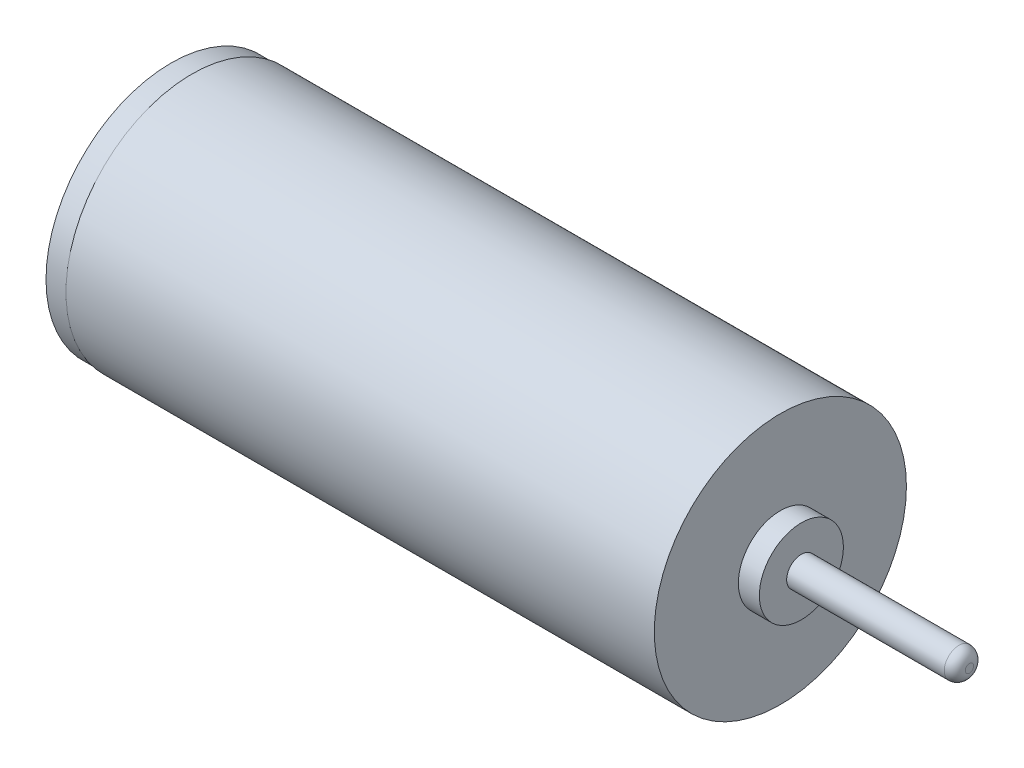
ISO-10303-21;
HEADER;
FILE_DESCRIPTION(('STEP AP214'),'2;1');
FILE_NAME('part.step','',(''),(''),'','','');
FILE_SCHEMA(('AUTOMOTIVE_DESIGN { 1 0 10303 214 1 1 1 1 }'));
ENDSEC;
DATA;
#1=APPLICATION_CONTEXT('core data for automotive mechanical design processes');
#2=APPLICATION_PROTOCOL_DEFINITION('international standard','automotive_design',2000,#1);
#3=PRODUCT_CONTEXT('',#1,'mechanical');
#4=PRODUCT('Part','Part','',(#3));
#5=PRODUCT_RELATED_PRODUCT_CATEGORY('part','',(#4));
#6=PRODUCT_DEFINITION_FORMATION('','',#4);
#7=PRODUCT_DEFINITION_CONTEXT('part definition',#1,'design');
#8=PRODUCT_DEFINITION('design','',#6,#7);
#9=PRODUCT_DEFINITION_SHAPE('','',#8);
#10=(LENGTH_UNIT() NAMED_UNIT(*) SI_UNIT(.MILLI.,.METRE.));
#11=(NAMED_UNIT(*) PLANE_ANGLE_UNIT() SI_UNIT($,.RADIAN.));
#12=(NAMED_UNIT(*) SI_UNIT($,.STERADIAN.) SOLID_ANGLE_UNIT());
#13=UNCERTAINTY_MEASURE_WITH_UNIT(LENGTH_MEASURE(1.E-05),#10,'distance_accuracy_value','');
#14=(GEOMETRIC_REPRESENTATION_CONTEXT(3) GLOBAL_UNCERTAINTY_ASSIGNED_CONTEXT((#13)) GLOBAL_UNIT_ASSIGNED_CONTEXT((#10,
#11,#12)) REPRESENTATION_CONTEXT('',''));
#15=CARTESIAN_POINT('',(0.,0.,0.));
#16=DIRECTION('',(0.,0.,1.));
#17=DIRECTION('',(1.,0.,0.));
#18=AXIS2_PLACEMENT_3D('',#15,#16,#17);
#19=CARTESIAN_POINT('',(-14.5,0.,0.));
#20=DIRECTION('',(-1.,0.,0.));
#21=DIRECTION('',(0.,0.,1.));
#22=AXIS2_PLACEMENT_3D('',#19,#20,#21);
#23=PLANE('',#22);
#24=CARTESIAN_POINT('',(-14.5,0.,0.));
#25=DIRECTION('',(-1.,0.,0.));
#26=DIRECTION('',(0.,0.,1.));
#27=AXIS2_PLACEMENT_3D('',#24,#25,#26);
#28=CIRCLE('',#27,2.975);
#29=CARTESIAN_POINT('',(-14.5,0.,2.975));
#30=VERTEX_POINT('',#29);
#31=EDGE_CURVE('E63',#30,#30,#28,.T.);
#32=ORIENTED_EDGE('',*,*,#31,.T.);
#33=EDGE_LOOP('',(#32));
#34=FACE_BOUND('',#33,.T.);
#35=CARTESIAN_POINT('',(-14.5,0.,0.));
#36=DIRECTION('',(-1.,0.,0.));
#37=DIRECTION('',(0.,0.,1.));
#38=AXIS2_PLACEMENT_3D('',#35,#36,#37);
#39=CIRCLE('',#38,1.);
#40=CARTESIAN_POINT('',(-14.5,0.,1.));
#41=VERTEX_POINT('',#40);
#42=EDGE_CURVE('E67',#41,#41,#39,.T.);
#43=ORIENTED_EDGE('',*,*,#42,.F.);
#44=EDGE_LOOP('',(#43));
#45=FACE_BOUND('',#44,.T.);
#46=ADVANCED_FACE('F31',(#34,#45),#23,.T.);
#47=CARTESIAN_POINT('',(-14.,0.,0.));
#48=DIRECTION('',(1.,0.,0.));
#49=DIRECTION('',(0.,0.,-1.));
#50=AXIS2_PLACEMENT_3D('',#47,#48,#49);
#51=PLANE('',#50);
#52=CARTESIAN_POINT('',(-14.,0.,0.));
#53=DIRECTION('',(1.,0.,0.));
#54=DIRECTION('',(0.,0.,-1.));
#55=AXIS2_PLACEMENT_3D('',#52,#53,#54);
#56=CIRCLE('',#55,3.);
#57=CARTESIAN_POINT('',(-14.,0.,-3.));
#58=VERTEX_POINT('',#57);
#59=EDGE_CURVE('E46',#58,#58,#56,.T.);
#60=ORIENTED_EDGE('',*,*,#59,.F.);
#61=EDGE_LOOP('',(#60));
#62=FACE_BOUND('',#61,.T.);
#63=CARTESIAN_POINT('',(-14.,0.,0.));
#64=DIRECTION('',(1.,0.,0.));
#65=DIRECTION('',(0.,0.,-1.));
#66=AXIS2_PLACEMENT_3D('',#63,#64,#65);
#67=CIRCLE('',#66,2.975);
#68=CARTESIAN_POINT('',(-14.,0.,-2.975));
#69=VERTEX_POINT('',#68);
#70=EDGE_CURVE('E10',#69,#69,#67,.F.);
#71=ORIENTED_EDGE('',*,*,#70,.F.);
#72=EDGE_LOOP('',(#71));
#73=FACE_BOUND('',#72,.T.);
#74=ADVANCED_FACE('F83',(#62,#73),#51,.F.);
#75=CARTESIAN_POINT('',(0.5,0.,0.));
#76=DIRECTION('',(1.,0.,0.));
#77=DIRECTION('',(0.,0.,-1.));
#78=AXIS2_PLACEMENT_3D('',#75,#76,#77);
#79=PLANE('',#78);
#80=CARTESIAN_POINT('',(0.5,0.,0.));
#81=DIRECTION('',(1.,0.,0.));
#82=DIRECTION('',(0.,0.,-1.));
#83=AXIS2_PLACEMENT_3D('',#80,#81,#82);
#84=CIRCLE('',#83,1.);
#85=CARTESIAN_POINT('',(0.5,0.,-1.));
#86=VERTEX_POINT('',#85);
#87=EDGE_CURVE('E52',#86,#86,#84,.T.);
#88=ORIENTED_EDGE('',*,*,#87,.T.);
#89=EDGE_LOOP('',(#88));
#90=FACE_BOUND('',#89,.T.);
#91=CARTESIAN_POINT('',(0.5,0.,0.));
#92=DIRECTION('',(1.,0.,0.));
#93=DIRECTION('',(0.,0.,-1.));
#94=AXIS2_PLACEMENT_3D('',#91,#92,#93);
#95=CIRCLE('',#94,0.35);
#96=CARTESIAN_POINT('',(0.5,0.,-0.35));
#97=VERTEX_POINT('',#96);
#98=EDGE_CURVE('E58',#97,#97,#95,.T.);
#99=ORIENTED_EDGE('',*,*,#98,.F.);
#100=EDGE_LOOP('',(#99));
#101=FACE_BOUND('',#100,.T.);
#102=ADVANCED_FACE('F89',(#90,#101),#79,.T.);
#103=CARTESIAN_POINT('',(0.,0.,0.));
#104=DIRECTION('',(1.,0.,0.));
#105=DIRECTION('',(0.,0.,-1.));
#106=AXIS2_PLACEMENT_3D('',#103,#104,#105);
#107=PLANE('',#106);
#108=CARTESIAN_POINT('',(0.,0.,0.));
#109=DIRECTION('',(1.,0.,0.));
#110=DIRECTION('',(0.,0.,-1.));
#111=AXIS2_PLACEMENT_3D('',#108,#109,#110);
#112=CIRCLE('',#111,3.);
#113=CARTESIAN_POINT('',(0.,0.,-3.));
#114=VERTEX_POINT('',#113);
#115=EDGE_CURVE('E49',#114,#114,#112,.T.);
#116=ORIENTED_EDGE('',*,*,#115,.T.);
#117=EDGE_LOOP('',(#116));
#118=FACE_BOUND('',#117,.T.);
#119=CARTESIAN_POINT('',(0.,0.,0.));
#120=DIRECTION('',(1.,0.,0.));
#121=DIRECTION('',(0.,0.,-1.));
#122=AXIS2_PLACEMENT_3D('',#119,#120,#121);
#123=CIRCLE('',#122,1.);
#124=CARTESIAN_POINT('',(0.,0.,-1.));
#125=VERTEX_POINT('',#124);
#126=EDGE_CURVE('E55',#125,#125,#123,.T.);
#127=ORIENTED_EDGE('',*,*,#126,.F.);
#128=EDGE_LOOP('',(#127));
#129=FACE_BOUND('',#128,.T.);
#130=ADVANCED_FACE('F107',(#118,#129),#107,.T.);
#131=CARTESIAN_POINT('',(-14.,0.,0.));
#132=DIRECTION('',(1.,0.,0.));
#133=DIRECTION('',(0.,0.,-1.));
#134=AXIS2_PLACEMENT_3D('',#131,#132,#133);
#135=CYLINDRICAL_SURFACE('',#134,3.);
#136=ORIENTED_EDGE('',*,*,#59,.T.);
#137=EDGE_LOOP('',(#136));
#138=FACE_BOUND('',#137,.T.);
#139=ORIENTED_EDGE('',*,*,#115,.F.);
#140=EDGE_LOOP('',(#139));
#141=FACE_BOUND('',#140,.T.);
#142=ADVANCED_FACE('F110',(#138,#141),#135,.T.);
#143=CARTESIAN_POINT('',(0.5,0.,0.));
#144=DIRECTION('',(-1.,0.,0.));
#145=DIRECTION('',(0.,0.,1.));
#146=AXIS2_PLACEMENT_3D('',#143,#144,#145);
#147=CYLINDRICAL_SURFACE('',#146,1.);
#148=ORIENTED_EDGE('',*,*,#87,.F.);
#149=EDGE_LOOP('',(#148));
#150=FACE_BOUND('',#149,.T.);
#151=ORIENTED_EDGE('',*,*,#126,.T.);
#152=EDGE_LOOP('',(#151));
#153=FACE_BOUND('',#152,.T.);
#154=ADVANCED_FACE('F104',(#150,#153),#147,.T.);
#155=CARTESIAN_POINT('',(4.5,0.,0.));
#156=DIRECTION('',(-1.,0.,0.));
#157=DIRECTION('',(0.,0.,1.));
#158=AXIS2_PLACEMENT_3D('',#155,#156,#157);
#159=CYLINDRICAL_SURFACE('',#158,0.35);
#160=CARTESIAN_POINT('',(4.25,0.,0.));
#161=DIRECTION('',(1.,0.,0.));
#162=DIRECTION('',(0.,0.,-1.));
#163=AXIS2_PLACEMENT_3D('',#160,#161,#162);
#164=CIRCLE('',#163,0.35);
#165=CARTESIAN_POINT('',(4.25,0.,-0.35));
#166=VERTEX_POINT('',#165);
#167=EDGE_CURVE('E38',#166,#166,#164,.F.);
#168=ORIENTED_EDGE('',*,*,#167,.T.);
#169=EDGE_LOOP('',(#168));
#170=FACE_BOUND('',#169,.T.);
#171=ORIENTED_EDGE('',*,*,#98,.T.);
#172=EDGE_LOOP('',(#171));
#173=FACE_BOUND('',#172,.T.);
#174=ADVANCED_FACE('F100',(#170,#173),#159,.T.);
#175=CARTESIAN_POINT('',(4.5,0.,0.));
#176=DIRECTION('',(1.,0.,0.));
#177=DIRECTION('',(0.,0.,-1.));
#178=AXIS2_PLACEMENT_3D('',#175,#176,#177);
#179=PLANE('',#178);
#180=CARTESIAN_POINT('',(4.5,0.,0.));
#181=DIRECTION('',(1.,0.,0.));
#182=DIRECTION('',(0.,0.,-1.));
#183=AXIS2_PLACEMENT_3D('',#180,#181,#182);
#184=CIRCLE('',#183,0.1);
#185=CARTESIAN_POINT('',(4.5,0.,-0.1));
#186=VERTEX_POINT('',#185);
#187=EDGE_CURVE('E42',#186,#186,#184,.T.);
#188=ORIENTED_EDGE('',*,*,#187,.T.);
#189=EDGE_LOOP('',(#188));
#190=FACE_BOUND('',#189,.T.);
#191=ADVANCED_FACE('F97',(#190),#179,.T.);
#192=CARTESIAN_POINT('',(4.25,0.,0.));
#193=DIRECTION('',(1.,0.,0.));
#194=DIRECTION('',(0.,0.,-1.));
#195=AXIS2_PLACEMENT_3D('',#192,#193,#194);
#196=DEGENERATE_TOROIDAL_SURFACE('',#195,0.1,0.25,.T.);
#197=ORIENTED_EDGE('',*,*,#167,.F.);
#198=EDGE_LOOP('',(#197));
#199=FACE_BOUND('',#198,.T.);
#200=ORIENTED_EDGE('',*,*,#187,.F.);
#201=EDGE_LOOP('',(#200));
#202=FACE_BOUND('',#201,.T.);
#203=ADVANCED_FACE('F33',(#199,#202),#196,.T.);
#204=CARTESIAN_POINT('',(-14.5,0.,0.));
#205=DIRECTION('',(1.,0.,0.));
#206=DIRECTION('',(0.,0.,-1.));
#207=AXIS2_PLACEMENT_3D('',#204,#205,#206);
#208=CYLINDRICAL_SURFACE('',#207,2.975);
#209=ORIENTED_EDGE('',*,*,#31,.F.);
#210=EDGE_LOOP('',(#209));
#211=FACE_BOUND('',#210,.T.);
#212=ORIENTED_EDGE('',*,*,#70,.T.);
#213=EDGE_LOOP('',(#212));
#214=FACE_BOUND('',#213,.T.);
#215=ADVANCED_FACE('F78',(#211,#214),#208,.T.);
#216=CARTESIAN_POINT('',(-15.5,0.,0.));
#217=DIRECTION('',(1.,0.,0.));
#218=DIRECTION('',(0.,0.,-1.));
#219=AXIS2_PLACEMENT_3D('',#216,#217,#218);
#220=CYLINDRICAL_SURFACE('',#219,1.);
#221=CARTESIAN_POINT('',(-15.5,0.,0.));
#222=DIRECTION('',(-1.,0.,0.));
#223=DIRECTION('',(0.,0.,1.));
#224=AXIS2_PLACEMENT_3D('',#221,#222,#223);
#225=CIRCLE('',#224,1.);
#226=CARTESIAN_POINT('',(-15.5,0.,1.));
#227=VERTEX_POINT('',#226);
#228=EDGE_CURVE('E66',#227,#227,#225,.T.);
#229=ORIENTED_EDGE('',*,*,#228,.F.);
#230=EDGE_LOOP('',(#229));
#231=FACE_BOUND('',#230,.T.);
#232=ORIENTED_EDGE('',*,*,#42,.T.);
#233=EDGE_LOOP('',(#232));
#234=FACE_BOUND('',#233,.T.);
#235=ADVANCED_FACE('F75',(#231,#234),#220,.T.);
#236=CARTESIAN_POINT('',(-15.5,0.,0.));
#237=DIRECTION('',(-1.,0.,0.));
#238=DIRECTION('',(0.,0.,1.));
#239=AXIS2_PLACEMENT_3D('',#236,#237,#238);
#240=PLANE('',#239);
#241=ORIENTED_EDGE('',*,*,#228,.T.);
#242=EDGE_LOOP('',(#241));
#243=FACE_BOUND('',#242,.T.);
#244=ADVANCED_FACE('F73',(#243),#240,.T.);
#245=CLOSED_SHELL('',(#46,#74,#102,#130,#142,#154,#174,#191,#203,#215,#235,#244));
#246=MANIFOLD_SOLID_BREP('B2',#245);
#247=ADVANCED_BREP_SHAPE_REPRESENTATION('',(#18,#246),#14);
#248=SHAPE_DEFINITION_REPRESENTATION(#9,#247);
ENDSEC;
END-ISO-10303-21;
